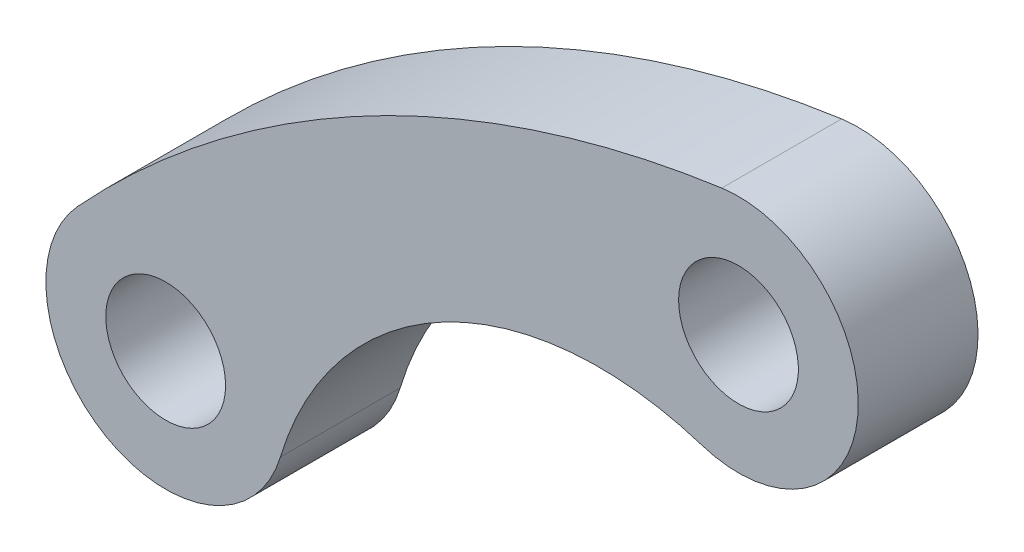
ISO-10303-21;
HEADER;
FILE_DESCRIPTION(('STEP AP214'),'2;1');
FILE_NAME('part.step','',(''),(''),'','','');
FILE_SCHEMA(('AUTOMOTIVE_DESIGN { 1 0 10303 214 1 1 1 1 }'));
ENDSEC;
DATA;
#1=APPLICATION_CONTEXT('core data for automotive mechanical design processes');
#2=APPLICATION_PROTOCOL_DEFINITION('international standard','automotive_design',2000,#1);
#3=PRODUCT_CONTEXT('',#1,'mechanical');
#4=PRODUCT('Part','Part','',(#3));
#5=PRODUCT_RELATED_PRODUCT_CATEGORY('part','',(#4));
#6=PRODUCT_DEFINITION_FORMATION('','',#4);
#7=PRODUCT_DEFINITION_CONTEXT('part definition',#1,'design');
#8=PRODUCT_DEFINITION('design','',#6,#7);
#9=PRODUCT_DEFINITION_SHAPE('','',#8);
#10=(LENGTH_UNIT() NAMED_UNIT(*) SI_UNIT(.MILLI.,.METRE.));
#11=(NAMED_UNIT(*) PLANE_ANGLE_UNIT() SI_UNIT($,.RADIAN.));
#12=(NAMED_UNIT(*) SI_UNIT($,.STERADIAN.) SOLID_ANGLE_UNIT());
#13=UNCERTAINTY_MEASURE_WITH_UNIT(LENGTH_MEASURE(1.E-05),#10,'distance_accuracy_value','');
#14=(GEOMETRIC_REPRESENTATION_CONTEXT(3) GLOBAL_UNCERTAINTY_ASSIGNED_CONTEXT((#13)) GLOBAL_UNIT_ASSIGNED_CONTEXT((#10,
#11,#12)) REPRESENTATION_CONTEXT('',''));
#15=CARTESIAN_POINT('',(0.,0.,0.));
#16=DIRECTION('',(0.,0.,1.));
#17=DIRECTION('',(1.,0.,0.));
#18=AXIS2_PLACEMENT_3D('',#15,#16,#17);
#19=CARTESIAN_POINT('',(0.,0.,7.));
#20=DIRECTION('',(0.,0.,1.));
#21=DIRECTION('',(1.,0.,0.));
#22=AXIS2_PLACEMENT_3D('',#19,#20,#21);
#23=CYLINDRICAL_SURFACE('',#22,3.);
#24=CARTESIAN_POINT('',(0.,0.,10.));
#25=DIRECTION('',(0.,0.,1.));
#26=DIRECTION('',(1.,0.,0.));
#27=AXIS2_PLACEMENT_3D('',#24,#25,#26);
#28=CIRCLE('',#27,3.);
#29=CARTESIAN_POINT('',(-2.20728348928676,2.03172330742207,10.));
#30=VERTEX_POINT('',#29);
#31=CARTESIAN_POINT('',(2.87329940826442,-0.862641588649267,10.));
#32=VERTEX_POINT('',#31);
#33=EDGE_CURVE('E101',#30,#32,#28,.T.);
#34=ORIENTED_EDGE('',*,*,#33,.F.);
#35=DIRECTION('',(0.,0.,1.));
#36=VECTOR('',#35,1.);
#37=CARTESIAN_POINT('',(-2.20728348928676,2.03172330742207,7.));
#38=LINE('',#37,#36);
#39=CARTESIAN_POINT('',(-2.20728348928676,2.03172330742207,7.));
#40=VERTEX_POINT('',#39);
#41=EDGE_CURVE('E11',#40,#30,#38,.T.);
#42=ORIENTED_EDGE('',*,*,#41,.F.);
#43=CARTESIAN_POINT('',(0.,0.,7.));
#44=DIRECTION('',(0.,0.,1.));
#45=DIRECTION('',(1.,0.,0.));
#46=AXIS2_PLACEMENT_3D('',#43,#44,#45);
#47=CIRCLE('',#46,3.);
#48=CARTESIAN_POINT('',(2.87329940826442,-0.862641588649267,7.));
#49=VERTEX_POINT('',#48);
#50=EDGE_CURVE('E94',#40,#49,#47,.T.);
#51=ORIENTED_EDGE('',*,*,#50,.T.);
#52=DIRECTION('',(0.,0.,1.));
#53=VECTOR('',#52,1.);
#54=CARTESIAN_POINT('',(2.87329940826442,-0.862641588649267,7.));
#55=LINE('',#54,#53);
#56=EDGE_CURVE('E38',#49,#32,#55,.T.);
#57=ORIENTED_EDGE('',*,*,#56,.T.);
#58=EDGE_LOOP('',(#34,#42,#51,#57));
#59=FACE_BOUND('',#58,.T.);
#60=ADVANCED_FACE('F35',(#59),#23,.T.);
#61=CARTESIAN_POINT('',(17.6965577984131,-16.28903089009,7.));
#62=DIRECTION('',(0.,0.,1.));
#63=DIRECTION('',(1.,0.,0.));
#64=AXIS2_PLACEMENT_3D('',#61,#62,#63);
#65=CYLINDRICAL_SURFACE('',#64,27.0520411867866);
#66=CARTESIAN_POINT('',(17.6965577984131,-16.28903089009,10.));
#67=DIRECTION('',(0.,0.,1.));
#68=DIRECTION('',(1.,0.,0.));
#69=AXIS2_PLACEMENT_3D('',#66,#67,#68);
#70=CIRCLE('',#69,27.0520411867866);
#71=CARTESIAN_POINT('',(13.9284598024903,10.4992943629885,10.));
#72=VERTEX_POINT('',#71);
#73=EDGE_CURVE('E96',#30,#72,#70,.F.);
#74=ORIENTED_EDGE('',*,*,#73,.T.);
#75=DIRECTION('',(0.,0.,1.));
#76=VECTOR('',#75,1.);
#77=CARTESIAN_POINT('',(13.9284598024903,10.4992943629885,7.));
#78=LINE('',#77,#76);
#79=CARTESIAN_POINT('',(13.9284598024903,10.4992943629885,7.));
#80=VERTEX_POINT('',#79);
#81=EDGE_CURVE('E44',#80,#72,#78,.T.);
#82=ORIENTED_EDGE('',*,*,#81,.F.);
#83=CARTESIAN_POINT('',(17.6965577984131,-16.28903089009,7.));
#84=DIRECTION('',(0.,0.,1.));
#85=DIRECTION('',(1.,0.,0.));
#86=AXIS2_PLACEMENT_3D('',#83,#84,#85);
#87=CIRCLE('',#86,27.0520411867866);
#88=EDGE_CURVE('E91',#40,#80,#87,.F.);
#89=ORIENTED_EDGE('',*,*,#88,.F.);
#90=ORIENTED_EDGE('',*,*,#41,.T.);
#91=EDGE_LOOP('',(#74,#82,#89,#90));
#92=FACE_BOUND('',#91,.T.);
#93=ADVANCED_FACE('F109',(#92),#65,.T.);
#94=CARTESIAN_POINT('',(14.3463319293925,7.52853976431191,7.));
#95=DIRECTION('',(0.,0.,1.));
#96=DIRECTION('',(1.,0.,0.));
#97=AXIS2_PLACEMENT_3D('',#94,#95,#96);
#98=CYLINDRICAL_SURFACE('',#97,3.);
#99=CARTESIAN_POINT('',(14.3463319293925,7.52853976431191,10.));
#100=DIRECTION('',(0.,0.,1.));
#101=DIRECTION('',(1.,0.,0.));
#102=AXIS2_PLACEMENT_3D('',#99,#100,#101);
#103=CIRCLE('',#102,3.);
#104=CARTESIAN_POINT('',(13.4237411362783,4.67392486410892,10.));
#105=VERTEX_POINT('',#104);
#106=EDGE_CURVE('E85',#105,#72,#103,.T.);
#107=ORIENTED_EDGE('',*,*,#106,.F.);
#108=DIRECTION('',(0.,0.,1.));
#109=VECTOR('',#108,1.);
#110=CARTESIAN_POINT('',(13.4237411362783,4.67392486410892,7.));
#111=LINE('',#110,#109);
#112=CARTESIAN_POINT('',(13.4237411362783,4.67392486410892,7.));
#113=VERTEX_POINT('',#112);
#114=EDGE_CURVE('E80',#113,#105,#111,.T.);
#115=ORIENTED_EDGE('',*,*,#114,.F.);
#116=CARTESIAN_POINT('',(14.3463319293925,7.52853976431191,7.));
#117=DIRECTION('',(0.,0.,1.));
#118=DIRECTION('',(1.,0.,0.));
#119=AXIS2_PLACEMENT_3D('',#116,#117,#118);
#120=CIRCLE('',#119,3.);
#121=EDGE_CURVE('E83',#113,#80,#120,.T.);
#122=ORIENTED_EDGE('',*,*,#121,.T.);
#123=ORIENTED_EDGE('',*,*,#81,.T.);
#124=EDGE_LOOP('',(#107,#115,#122,#123));
#125=FACE_BOUND('',#124,.T.);
#126=ADVANCED_FACE('F82',(#125),#98,.T.);
#127=CARTESIAN_POINT('',(10.8594571646244,-3.26030045926148,7.));
#128=DIRECTION('',(0.,0.,1.));
#129=DIRECTION('',(1.,0.,0.));
#130=AXIS2_PLACEMENT_3D('',#127,#128,#129);
#131=CYLINDRICAL_SURFACE('',#130,8.33831420427976);
#132=CARTESIAN_POINT('',(10.8594571646244,-3.26030045926148,10.));
#133=DIRECTION('',(0.,0.,1.));
#134=DIRECTION('',(1.,0.,0.));
#135=AXIS2_PLACEMENT_3D('',#132,#133,#134);
#136=CIRCLE('',#135,8.33831420427976);
#137=EDGE_CURVE('E104',#32,#105,#136,.F.);
#138=ORIENTED_EDGE('',*,*,#137,.F.);
#139=ORIENTED_EDGE('',*,*,#56,.F.);
#140=CARTESIAN_POINT('',(10.8594571646244,-3.26030045926148,7.));
#141=DIRECTION('',(0.,0.,1.));
#142=DIRECTION('',(1.,0.,0.));
#143=AXIS2_PLACEMENT_3D('',#140,#141,#142);
#144=CIRCLE('',#143,8.33831420427976);
#145=EDGE_CURVE('E90',#49,#113,#144,.F.);
#146=ORIENTED_EDGE('',*,*,#145,.T.);
#147=ORIENTED_EDGE('',*,*,#114,.T.);
#148=EDGE_LOOP('',(#138,#139,#146,#147));
#149=FACE_BOUND('',#148,.T.);
#150=ADVANCED_FACE('F93',(#149),#131,.F.);
#151=CARTESIAN_POINT('',(0.,0.,7.));
#152=DIRECTION('',(0.,0.,1.));
#153=DIRECTION('',(1.,0.,0.));
#154=AXIS2_PLACEMENT_3D('',#151,#152,#153);
#155=PLANE('',#154);
#156=CARTESIAN_POINT('',(0.,0.,7.));
#157=DIRECTION('',(0.,0.,1.));
#158=DIRECTION('',(1.,0.,0.));
#159=AXIS2_PLACEMENT_3D('',#156,#157,#158);
#160=CIRCLE('',#159,1.5);
#161=CARTESIAN_POINT('',(1.5,0.,7.));
#162=VERTEX_POINT('',#161);
#163=EDGE_CURVE('E149',#162,#162,#160,.F.);
#164=ORIENTED_EDGE('',*,*,#163,.F.);
#165=EDGE_LOOP('',(#164));
#166=FACE_BOUND('',#165,.T.);
#167=CARTESIAN_POINT('',(14.3463319293925,7.52853976431191,7.));
#168=DIRECTION('',(0.,0.,1.));
#169=DIRECTION('',(1.,0.,0.));
#170=AXIS2_PLACEMENT_3D('',#167,#168,#169);
#171=CIRCLE('',#170,1.5);
#172=CARTESIAN_POINT('',(15.8463319293925,7.52853976431191,7.));
#173=VERTEX_POINT('',#172);
#174=EDGE_CURVE('E105',#173,#173,#171,.T.);
#175=ORIENTED_EDGE('',*,*,#174,.T.);
#176=EDGE_LOOP('',(#175));
#177=FACE_BOUND('',#176,.T.);
#178=ORIENTED_EDGE('',*,*,#50,.F.);
#179=ORIENTED_EDGE('',*,*,#88,.T.);
#180=ORIENTED_EDGE('',*,*,#121,.F.);
#181=ORIENTED_EDGE('',*,*,#145,.F.);
#182=EDGE_LOOP('',(#178,#179,#180,#181));
#183=FACE_BOUND('',#182,.T.);
#184=ADVANCED_FACE('F89',(#166,#177,#183),#155,.F.);
#185=CARTESIAN_POINT('',(0.,0.,10.));
#186=DIRECTION('',(0.,0.,1.));
#187=DIRECTION('',(1.,0.,0.));
#188=AXIS2_PLACEMENT_3D('',#185,#186,#187);
#189=PLANE('',#188);
#190=CARTESIAN_POINT('',(0.,0.,10.));
#191=DIRECTION('',(0.,0.,1.));
#192=DIRECTION('',(1.,0.,0.));
#193=AXIS2_PLACEMENT_3D('',#190,#191,#192);
#194=CIRCLE('',#193,1.5);
#195=CARTESIAN_POINT('',(1.5,0.,10.));
#196=VERTEX_POINT('',#195);
#197=EDGE_CURVE('E147',#196,#196,#194,.T.);
#198=ORIENTED_EDGE('',*,*,#197,.F.);
#199=EDGE_LOOP('',(#198));
#200=FACE_BOUND('',#199,.T.);
#201=CARTESIAN_POINT('',(14.3463319293925,7.52853976431191,10.));
#202=DIRECTION('',(0.,0.,-1.));
#203=DIRECTION('',(-1.,0.,0.));
#204=AXIS2_PLACEMENT_3D('',#201,#202,#203);
#205=CIRCLE('',#204,1.5);
#206=CARTESIAN_POINT('',(12.8463319293925,7.52853976431191,10.));
#207=VERTEX_POINT('',#206);
#208=EDGE_CURVE('E150',#207,#207,#205,.T.);
#209=ORIENTED_EDGE('',*,*,#208,.T.);
#210=EDGE_LOOP('',(#209));
#211=FACE_BOUND('',#210,.T.);
#212=ORIENTED_EDGE('',*,*,#33,.T.);
#213=ORIENTED_EDGE('',*,*,#137,.T.);
#214=ORIENTED_EDGE('',*,*,#106,.T.);
#215=ORIENTED_EDGE('',*,*,#73,.F.);
#216=EDGE_LOOP('',(#212,#213,#214,#215));
#217=FACE_BOUND('',#216,.T.);
#218=ADVANCED_FACE('F111',(#200,#211,#217),#189,.T.);
#219=CARTESIAN_POINT('',(14.3463319293925,7.52853976431191,10.));
#220=DIRECTION('',(0.,0.,-1.));
#221=DIRECTION('',(-1.,0.,0.));
#222=AXIS2_PLACEMENT_3D('',#219,#220,#221);
#223=CYLINDRICAL_SURFACE('',#222,1.5);
#224=ORIENTED_EDGE('',*,*,#208,.F.);
#225=EDGE_LOOP('',(#224));
#226=FACE_BOUND('',#225,.T.);
#227=ORIENTED_EDGE('',*,*,#174,.F.);
#228=EDGE_LOOP('',(#227));
#229=FACE_BOUND('',#228,.T.);
#230=ADVANCED_FACE('F131',(#226,#229),#223,.F.);
#231=CARTESIAN_POINT('',(0.,0.,-0.000999999999999265));
#232=DIRECTION('',(0.,0.,1.));
#233=DIRECTION('',(1.,0.,0.));
#234=AXIS2_PLACEMENT_3D('',#231,#232,#233);
#235=CYLINDRICAL_SURFACE('',#234,1.5);
#236=ORIENTED_EDGE('',*,*,#197,.T.);
#237=EDGE_LOOP('',(#236));
#238=FACE_BOUND('',#237,.T.);
#239=ORIENTED_EDGE('',*,*,#163,.T.);
#240=EDGE_LOOP('',(#239));
#241=FACE_BOUND('',#240,.T.);
#242=ADVANCED_FACE('F138',(#238,#241),#235,.F.);
#243=CLOSED_SHELL('',(#60,#93,#126,#150,#184,#218,#230,#242));
#244=MANIFOLD_SOLID_BREP('B2',#243);
#245=ADVANCED_BREP_SHAPE_REPRESENTATION('',(#18,#244),#14);
#246=SHAPE_DEFINITION_REPRESENTATION(#9,#245);
ENDSEC;
END-ISO-10303-21;
